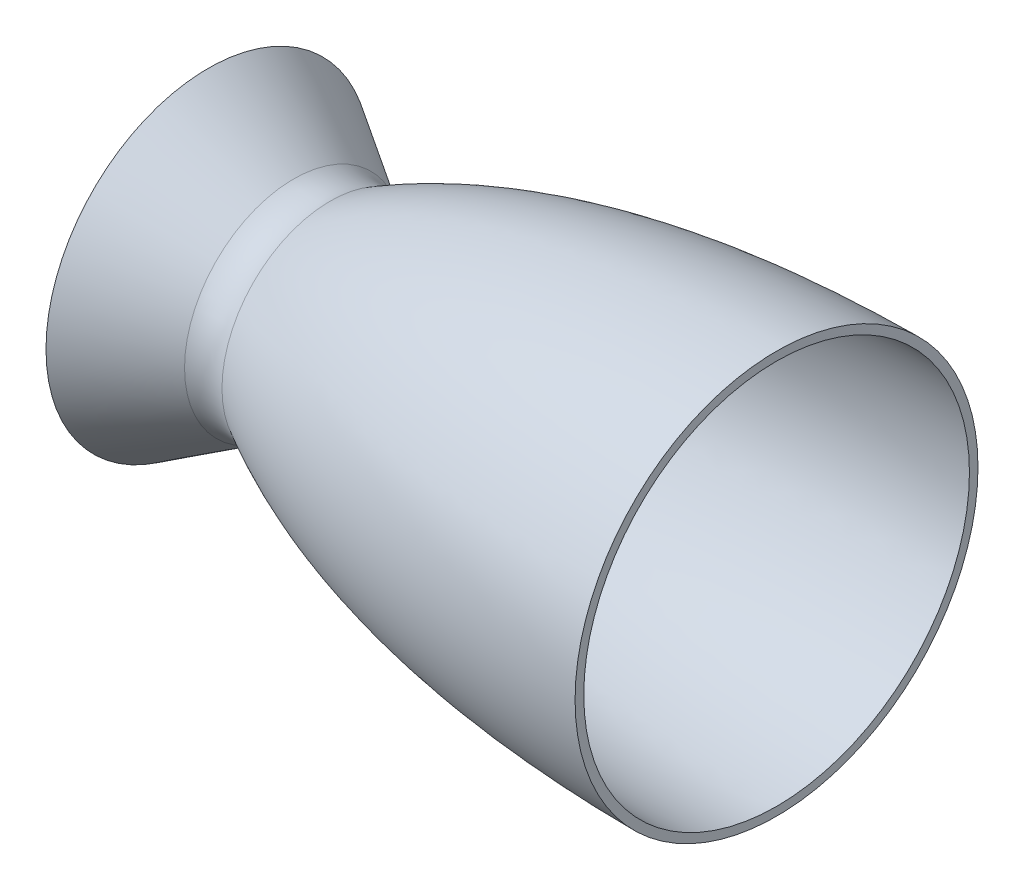
ISO-10303-21;
HEADER;
FILE_DESCRIPTION(('STEP AP214'),'2;1');
FILE_NAME('part.step','',(''),(''),'','','');
FILE_SCHEMA(('AUTOMOTIVE_DESIGN { 1 0 10303 214 1 1 1 1 }'));
ENDSEC;
DATA;
#1=APPLICATION_CONTEXT('core data for automotive mechanical design processes');
#2=APPLICATION_PROTOCOL_DEFINITION('international standard','automotive_design',2000,#1);
#3=PRODUCT_CONTEXT('',#1,'mechanical');
#4=PRODUCT('Part','Part','',(#3));
#5=PRODUCT_RELATED_PRODUCT_CATEGORY('part','',(#4));
#6=PRODUCT_DEFINITION_FORMATION('','',#4);
#7=PRODUCT_DEFINITION_CONTEXT('part definition',#1,'design');
#8=PRODUCT_DEFINITION('design','',#6,#7);
#9=PRODUCT_DEFINITION_SHAPE('','',#8);
#10=(LENGTH_UNIT() NAMED_UNIT(*) SI_UNIT(.MILLI.,.METRE.));
#11=(NAMED_UNIT(*) PLANE_ANGLE_UNIT() SI_UNIT($,.RADIAN.));
#12=(NAMED_UNIT(*) SI_UNIT($,.STERADIAN.) SOLID_ANGLE_UNIT());
#13=UNCERTAINTY_MEASURE_WITH_UNIT(LENGTH_MEASURE(1.E-05),#10,'distance_accuracy_value','');
#14=(GEOMETRIC_REPRESENTATION_CONTEXT(3) GLOBAL_UNCERTAINTY_ASSIGNED_CONTEXT((#13)) GLOBAL_UNIT_ASSIGNED_CONTEXT((#10,
#11,#12)) REPRESENTATION_CONTEXT('',''));
#15=CARTESIAN_POINT('',(0.,0.,0.));
#16=DIRECTION('',(0.,0.,1.));
#17=DIRECTION('',(1.,0.,0.));
#18=AXIS2_PLACEMENT_3D('',#15,#16,#17);
#19=CARTESIAN_POINT('',(0.,35.,0.));
#20=CARTESIAN_POINT('',(0.591560180338256,35.3234856171622,0.));
#21=CARTESIAN_POINT('',(1.60394882064774,35.8770948271858,0.));
#22=CARTESIAN_POINT('',(3.05132740305837,36.6509311008072,0.));
#23=CARTESIAN_POINT('',(4.3461417747581,37.3307209530643,0.));
#24=CARTESIAN_POINT('',(6.58635257148159,38.4850202122321,0.));
#25=CARTESIAN_POINT('',(8.88321711575811,39.6232856439451,0.));
#26=CARTESIAN_POINT('',(11.2377678233211,40.7449233741401,0.));
#27=CARTESIAN_POINT('',(13.2144815434296,41.6673749387768,0.));
#28=CARTESIAN_POINT('',(15.2393497066062,42.5825178049832,0.));
#29=CARTESIAN_POINT('',(17.3137014169799,43.490027515082,0.));
#30=CARTESIAN_POINT('',(19.4773513726983,44.4155438615646,0.));
#31=CARTESIAN_POINT('',(22.279340199476,45.5729343891576,0.));
#32=CARTESIAN_POINT('',(25.1582082897976,46.7060652594188,0.));
#33=CARTESIAN_POINT('',(27.544902902811,47.6109727979707,0.));
#34=CARTESIAN_POINT('',(30.0436239514037,48.5340701342933,0.));
#35=CARTESIAN_POINT('',(32.6097167227088,49.4442540549348,0.));
#36=CARTESIAN_POINT('',(35.2451432810151,50.3409724226616,0.));
#37=CARTESIAN_POINT('',(37.2955100011741,51.0186731509172,0.));
#38=CARTESIAN_POINT('',(40.1349354147298,51.9296058173831,0.));
#39=CARTESIAN_POINT('',(43.8297819452739,53.0604523352855,0.));
#40=CARTESIAN_POINT('',(47.635228948169,54.151189621845,0.));
#41=CARTESIAN_POINT('',(50.8048903471509,55.0139255739436,0.));
#42=CARTESIAN_POINT('',(53.2790423892637,55.6633291310861,0.));
#43=CARTESIAN_POINT('',(56.7171801665894,56.5322876140526,0.));
#44=CARTESIAN_POINT('',(60.2590723406974,57.375212698255,0.));
#45=CARTESIAN_POINT('',(64.8843176999941,58.409306156594,0.));
#46=CARTESIAN_POINT('',(69.7861900319958,59.4328370445254,0.));
#47=CARTESIAN_POINT('',(74.8467038170301,60.3910322154178,0.));
#48=CARTESIAN_POINT('',(79.0814911532876,61.1319617842223,0.));
#49=CARTESIAN_POINT('',(82.4043120217036,61.6810119456667,0.));
#50=CARTESIAN_POINT('',(85.8329793976566,62.214214905971,0.));
#51=CARTESIAN_POINT('',(89.3721629298813,62.7301810938718,0.));
#52=CARTESIAN_POINT('',(93.026774406431,63.2274670500099,0.));
#53=CARTESIAN_POINT('',(96.8020236764459,63.7044421458788,0.));
#54=CARTESIAN_POINT('',(100.703406603535,64.1594069337312,0.));
#55=CARTESIAN_POINT('',(104.73674358524,64.590566243845,0.));
#56=CARTESIAN_POINT('',(108.908202819255,64.9959176591084,0.));
#57=CARTESIAN_POINT('',(113.224319768674,65.3733592767064,0.));
#58=CARTESIAN_POINT('',(117.692028583078,65.7206194486257,0.));
#59=CARTESIAN_POINT('',(122.318697891959,66.0352320105548,0.));
#60=CARTESIAN_POINT('',(127.112150271402,66.3146043203392,0.));
#61=CARTESIAN_POINT('',(132.080718013521,66.5558103461246,0.));
#62=CARTESIAN_POINT('',(137.233267301942,66.7560844341287,0.));
#63=CARTESIAN_POINT('',(142.579264899576,66.9109473369614,0.));
#64=CARTESIAN_POINT('',(148.128776442859,67.0214682915378,0.));
#65=CARTESIAN_POINT('',(151.897616649166,67.0502551083509,0.));
#66=CARTESIAN_POINT('',(153.81758,67.06492,0.));
#67=B_SPLINE_CURVE_WITH_KNOTS('',3,(#19,#20,#21,#22,#23,#24,#25,#26,#27,#28,#29,#30,#31,#32,#33,
#34,#35,#36,#37,#38,#39,#40,#41,#42,#43,#44,#45,#46,#47,#48,#49,#50,#51,#52,#53,#54,#55,#56,#57,
#58,#59,#60,#61,#62,#63,#64,#65,#66),.UNSPECIFIED.,.F.,.F.,(4,1,1,1,1,1,1,1,1,1,1,1,1,1,1,1,1,1,
1,1,1,1,1,1,1,1,1,1,1,1,1,1,1,1,1,1,1,1,1,1,1,1,1,1,1,4),(0.,0.0127425345088177,
0.0218074130312527,0.0310185520247556,0.0403811930709218,0.0694357118392236,0.0794628618010737,
0.0896716910074709,0.110661788410253,0.121457293018654,0.132463052034478,0.15513721733729,
0.178751144085319,0.190932866870479,0.203377259639631,0.229094581673697,0.242389023461899,
0.255989108517032,0.269906814042492,0.298745971897886,0.329014118937115,0.344720544726017,
0.360829491646896,0.377357567613553,0.411741901107515,0.429635854767071,0.466929188304132,
0.506378365968707,0.526971723928778,0.548179084329846,0.570028568054957,0.592549693192431,
0.615773907389069,0.639734295061364,0.664466085625604,0.690006589945043,0.716395429702362,
0.743674650807629,0.77188903994371,0.80108620201666,0.831316903993932,0.862635143924416,
0.895098748334725,0.928769334252591,0.963712903650921,1.),.UNSPECIFIED.);
#68=CARTESIAN_POINT('',(-85.9163626790154,0.,0.));
#69=DIRECTION('',(-1.,0.,0.));
#70=AXIS1_PLACEMENT('',#68,#69);
#71=SURFACE_OF_REVOLUTION('',#67,#70);
#72=CARTESIAN_POINT('',(153.81758,0.,0.));
#73=DIRECTION('',(-1.,0.,0.));
#74=DIRECTION('',(0.,0.,1.));
#75=AXIS2_PLACEMENT_3D('',#72,#73,#74);
#76=CIRCLE('',#75,67.06492);
#77=CARTESIAN_POINT('',(153.81758,0.,67.06492));
#78=VERTEX_POINT('',#77);
#79=EDGE_CURVE('E10',#78,#78,#76,.T.);
#80=ORIENTED_EDGE('',*,*,#79,.F.);
#81=EDGE_LOOP('',(#80));
#82=FACE_BOUND('',#81,.T.);
#83=CARTESIAN_POINT('',(0.,0.,0.));
#84=DIRECTION('',(-1.,0.,0.));
#85=DIRECTION('',(0.,0.,1.));
#86=AXIS2_PLACEMENT_3D('',#83,#84,#85);
#87=CIRCLE('',#86,35.);
#88=CARTESIAN_POINT('',(0.,0.,35.));
#89=VERTEX_POINT('',#88);
#90=EDGE_CURVE('E60',#89,#89,#87,.T.);
#91=ORIENTED_EDGE('',*,*,#90,.T.);
#92=EDGE_LOOP('',(#91));
#93=FACE_BOUND('',#92,.T.);
#94=ADVANCED_FACE('F31',(#82,#93),#71,.T.);
#95=CARTESIAN_POINT('',(153.81758,0.,0.));
#96=DIRECTION('',(-1.,0.,0.));
#97=DIRECTION('',(0.,0.,1.));
#98=AXIS2_PLACEMENT_3D('',#95,#96,#97);
#99=CONICAL_SURFACE('',#98,67.06492,1.56315836512968);
#100=CARTESIAN_POINT('',(153.794666337797,0.,0.));
#101=DIRECTION('',(-1.,0.,0.));
#102=DIRECTION('',(0.,0.,1.));
#103=AXIS2_PLACEMENT_3D('',#100,#101,#102);
#104=CIRCLE('',#103,70.0648324927378);
#105=CARTESIAN_POINT('',(153.794666337797,0.,70.0648324927378));
#106=VERTEX_POINT('',#105);
#107=EDGE_CURVE('E38',#106,#106,#104,.T.);
#108=ORIENTED_EDGE('',*,*,#107,.F.);
#109=EDGE_LOOP('',(#108));
#110=FACE_BOUND('',#109,.T.);
#111=ORIENTED_EDGE('',*,*,#79,.T.);
#112=EDGE_LOOP('',(#111));
#113=FACE_BOUND('',#112,.T.);
#114=ADVANCED_FACE('F77',(#110,#113),#99,.T.);
#115=CARTESIAN_POINT('',(153.794666337797,70.0648324927378,0.));
#116=CARTESIAN_POINT('',(150.473331624406,70.0394637721937,0.));
#117=CARTESIAN_POINT('',(143.833403176418,69.9662192346066,0.));
#118=CARTESIAN_POINT('',(130.536302376422,69.5515619116336,0.));
#119=CARTESIAN_POINT('',(107.285483452244,68.1874563597517,0.));
#120=CARTESIAN_POINT('',(80.7988591635013,64.9122092766658,0.));
#121=CARTESIAN_POINT('',(54.6634745720933,59.3412037857768,0.));
#122=CARTESIAN_POINT('',(35.3604610613306,53.8209933139376,0.));
#123=CARTESIAN_POINT('',(19.6577673879117,47.9317432765425,0.));
#124=CARTESIAN_POINT('',(8.980017901085,43.0445042510961,0.));
#125=CARTESIAN_POINT('',(2.9738542501352,40.0233496196943,0.));
#126=CARTESIAN_POINT('',(0.0297402242779958,38.4355104799234,0.));
#127=CARTESIAN_POINT('',(-1.43935531315442,37.6321581036279,0.));
#128=B_SPLINE_CURVE_WITH_KNOTS('',3,(#115,#116,#117,#118,#119,#120,#121,#122,#123,#124,#125,
#126,#127),.UNSPECIFIED.,.F.,.F.,(4,1,1,1,1,1,1,1,1,1,4),(0.,0.0625,0.125,0.25,0.5,0.625,0.75,
0.875,0.9375,0.96875,1.),.UNSPECIFIED.);
#129=CARTESIAN_POINT('',(-85.9163626790154,0.,0.));
#130=DIRECTION('',(-1.,0.,0.));
#131=AXIS1_PLACEMENT('',#129,#130);
#132=SURFACE_OF_REVOLUTION('',#128,#131);
#133=CARTESIAN_POINT('',(-1.43935531315442,0.,0.));
#134=DIRECTION('',(-1.,0.,0.));
#135=DIRECTION('',(0.,0.,1.));
#136=AXIS2_PLACEMENT_3D('',#133,#134,#135);
#137=CIRCLE('',#136,37.6321581036279);
#138=CARTESIAN_POINT('',(-1.43935531315442,0.,37.6321581036279));
#139=VERTEX_POINT('',#138);
#140=EDGE_CURVE('E42',#139,#139,#137,.T.);
#141=ORIENTED_EDGE('',*,*,#140,.F.);
#142=EDGE_LOOP('',(#141));
#143=FACE_BOUND('',#142,.T.);
#144=ORIENTED_EDGE('',*,*,#107,.T.);
#145=EDGE_LOOP('',(#144));
#146=FACE_BOUND('',#145,.T.);
#147=ADVANCED_FACE('F73',(#143,#146),#132,.T.);
#148=CARTESIAN_POINT('',(-7.40785596341145,0.,0.));
#149=DIRECTION('',(-1.,0.,0.));
#150=DIRECTION('',(0.,0.,1.));
#151=AXIS2_PLACEMENT_3D('',#148,#149,#150);
#152=TOROIDAL_SURFACE('',#151,51.3935897147606,15.);
#153=CARTESIAN_POINT('',(-14.1132459120902,0.,0.));
#154=DIRECTION('',(-1.,0.,0.));
#155=DIRECTION('',(0.,0.,1.));
#156=AXIS2_PLACEMENT_3D('',#153,#154,#155);
#157=CIRCLE('',#156,37.9757752266945);
#158=CARTESIAN_POINT('',(-14.1132459120902,0.,37.9757752266945));
#159=VERTEX_POINT('',#158);
#160=EDGE_CURVE('E46',#159,#159,#157,.T.);
#161=ORIENTED_EDGE('',*,*,#160,.F.);
#162=EDGE_LOOP('',(#161));
#163=FACE_BOUND('',#162,.T.);
#164=ORIENTED_EDGE('',*,*,#140,.T.);
#165=EDGE_LOOP('',(#164));
#166=FACE_BOUND('',#165,.T.);
#167=ADVANCED_FACE('F76',(#163,#166),#152,.F.);
#168=CARTESIAN_POINT('',(-14.1132459120902,0.,0.));
#169=DIRECTION('',(-1.,0.,0.));
#170=DIRECTION('',(0.,0.,1.));
#171=AXIS2_PLACEMENT_3D('',#168,#169,#170);
#172=CONICAL_SURFACE('',#171,37.9757752266945,0.554620898954204);
#173=CARTESIAN_POINT('',(-43.8667509502843,0.,0.));
#174=DIRECTION('',(-1.,0.,0.));
#175=DIRECTION('',(0.,0.,1.));
#176=AXIS2_PLACEMENT_3D('',#173,#174,#175);
#177=CIRCLE('',#176,56.4075124736866);
#178=CARTESIAN_POINT('',(-43.8667509502843,0.,56.4075124736866));
#179=VERTEX_POINT('',#178);
#180=EDGE_CURVE('E51',#179,#179,#177,.T.);
#181=ORIENTED_EDGE('',*,*,#180,.F.);
#182=EDGE_LOOP('',(#181));
#183=FACE_BOUND('',#182,.T.);
#184=ORIENTED_EDGE('',*,*,#160,.T.);
#185=EDGE_LOOP('',(#184));
#186=FACE_BOUND('',#185,.T.);
#187=ADVANCED_FACE('F106',(#183,#186),#172,.T.);
#188=CARTESIAN_POINT('',(-43.8667509502843,0.,0.));
#189=DIRECTION('',(1.,0.,0.));
#190=DIRECTION('',(0.,0.,-1.));
#191=AXIS2_PLACEMENT_3D('',#188,#189,#190);
#192=CONICAL_SURFACE('',#191,56.4075124736866,1.01617542784069);
#193=CARTESIAN_POINT('',(-45.4466141428837,0.,0.));
#194=DIRECTION('',(-1.,0.,0.));
#195=DIRECTION('',(0.,0.,1.));
#196=AXIS2_PLACEMENT_3D('',#193,#194,#195);
#197=CIRCLE('',#196,53.8572120418414);
#198=CARTESIAN_POINT('',(-45.4466141428837,0.,53.8572120418414));
#199=VERTEX_POINT('',#198);
#200=EDGE_CURVE('E54',#199,#199,#197,.T.);
#201=ORIENTED_EDGE('',*,*,#200,.F.);
#202=EDGE_LOOP('',(#201));
#203=FACE_BOUND('',#202,.T.);
#204=ORIENTED_EDGE('',*,*,#180,.T.);
#205=EDGE_LOOP('',(#204));
#206=FACE_BOUND('',#205,.T.);
#207=ADVANCED_FACE('F100',(#203,#206),#192,.T.);
#208=CARTESIAN_POINT('',(-45.4466141428837,0.,0.));
#209=DIRECTION('',(-1.,0.,0.));
#210=DIRECTION('',(0.,0.,1.));
#211=AXIS2_PLACEMENT_3D('',#208,#209,#210);
#212=CONICAL_SURFACE('',#211,53.8572120418414,0.554620898954204);
#213=CARTESIAN_POINT('',(-15.6931091046896,0.,0.));
#214=DIRECTION('',(-1.,0.,0.));
#215=DIRECTION('',(0.,0.,1.));
#216=AXIS2_PLACEMENT_3D('',#213,#214,#215);
#217=CIRCLE('',#216,35.4254747948492);
#218=CARTESIAN_POINT('',(-15.6931091046896,0.,35.4254747948492));
#219=VERTEX_POINT('',#218);
#220=EDGE_CURVE('E57',#219,#219,#217,.T.);
#221=ORIENTED_EDGE('',*,*,#220,.F.);
#222=EDGE_LOOP('',(#221));
#223=FACE_BOUND('',#222,.T.);
#224=ORIENTED_EDGE('',*,*,#200,.T.);
#225=EDGE_LOOP('',(#224));
#226=FACE_BOUND('',#225,.T.);
#227=ADVANCED_FACE('F94',(#223,#226),#212,.F.);
#228=CARTESIAN_POINT('',(-7.40785596341145,0.,0.));
#229=DIRECTION('',(-1.,0.,0.));
#230=DIRECTION('',(0.,0.,1.));
#231=AXIS2_PLACEMENT_3D('',#228,#229,#230);
#232=TOROIDAL_SURFACE('',#231,51.3935897147606,17.9896112718022);
#233=ORIENTED_EDGE('',*,*,#90,.F.);
#234=EDGE_LOOP('',(#233));
#235=FACE_BOUND('',#234,.T.);
#236=ORIENTED_EDGE('',*,*,#220,.T.);
#237=EDGE_LOOP('',(#236));
#238=FACE_BOUND('',#237,.T.);
#239=ADVANCED_FACE('F91',(#235,#238),#232,.T.);
#240=CLOSED_SHELL('',(#94,#114,#147,#167,#187,#207,#227,#239));
#241=MANIFOLD_SOLID_BREP('B2',#240);
#242=ADVANCED_BREP_SHAPE_REPRESENTATION('',(#18,#241),#14);
#243=SHAPE_DEFINITION_REPRESENTATION(#9,#242);
ENDSEC;
END-ISO-10303-21;
